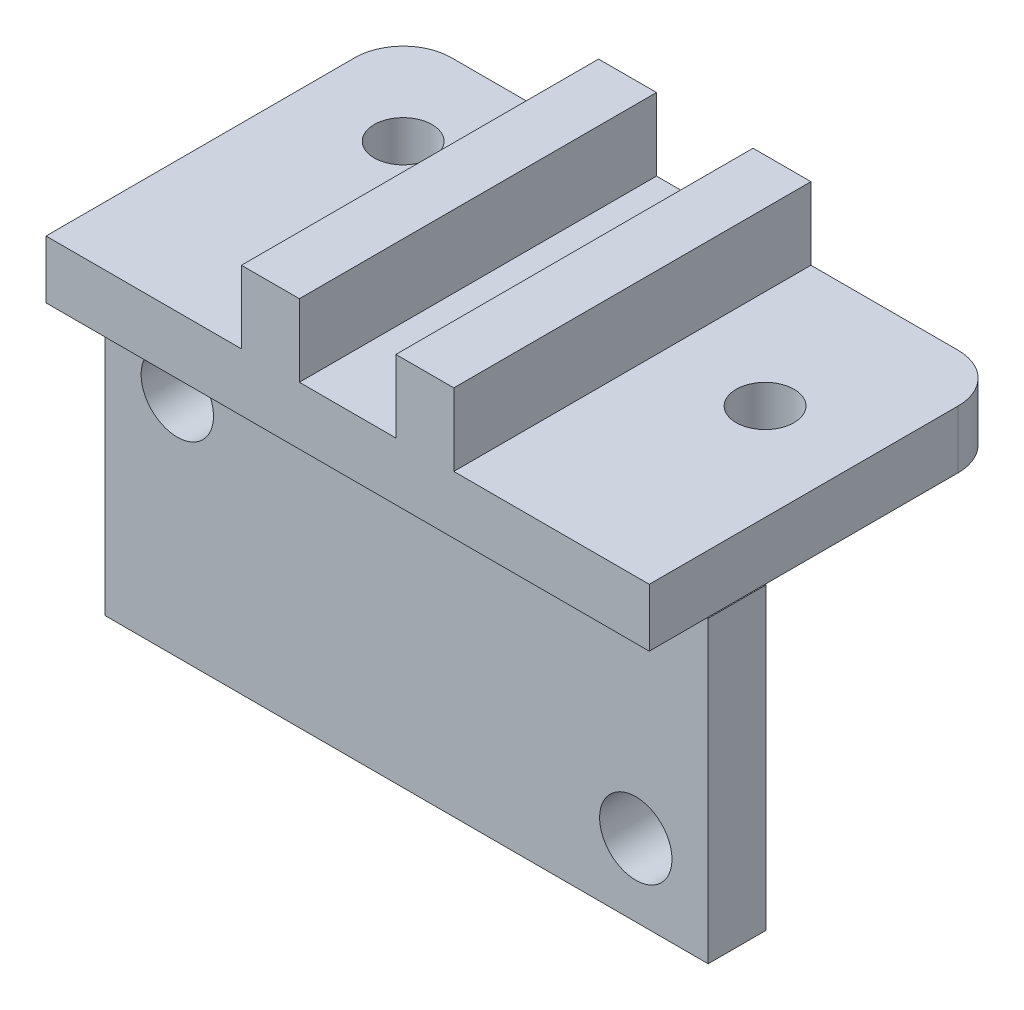
ISO-10303-21;
HEADER;
FILE_DESCRIPTION(('STEP AP214'),'2;1');
FILE_NAME('part.step','',(''),(''),'','','');
FILE_SCHEMA(('AUTOMOTIVE_DESIGN { 1 0 10303 214 1 1 1 1 }'));
ENDSEC;
DATA;
#1=APPLICATION_CONTEXT('core data for automotive mechanical design processes');
#2=APPLICATION_PROTOCOL_DEFINITION('international standard','automotive_design',2000,#1);
#3=PRODUCT_CONTEXT('',#1,'mechanical');
#4=PRODUCT('Part','Part','',(#3));
#5=PRODUCT_RELATED_PRODUCT_CATEGORY('part','',(#4));
#6=PRODUCT_DEFINITION_FORMATION('','',#4);
#7=PRODUCT_DEFINITION_CONTEXT('part definition',#1,'design');
#8=PRODUCT_DEFINITION('design','',#6,#7);
#9=PRODUCT_DEFINITION_SHAPE('','',#8);
#10=(LENGTH_UNIT() NAMED_UNIT(*) SI_UNIT(.MILLI.,.METRE.));
#11=(NAMED_UNIT(*) PLANE_ANGLE_UNIT() SI_UNIT($,.RADIAN.));
#12=(NAMED_UNIT(*) SI_UNIT($,.STERADIAN.) SOLID_ANGLE_UNIT());
#13=UNCERTAINTY_MEASURE_WITH_UNIT(LENGTH_MEASURE(1.E-05),#10,'distance_accuracy_value','');
#14=(GEOMETRIC_REPRESENTATION_CONTEXT(3) GLOBAL_UNCERTAINTY_ASSIGNED_CONTEXT((#13)) GLOBAL_UNIT_ASSIGNED_CONTEXT((#10,
#11,#12)) REPRESENTATION_CONTEXT('',''));
#15=CARTESIAN_POINT('',(0.,0.,0.));
#16=DIRECTION('',(0.,0.,1.));
#17=DIRECTION('',(1.,0.,0.));
#18=AXIS2_PLACEMENT_3D('',#15,#16,#17);
#19=CARTESIAN_POINT('',(0.,0.,0.));
#20=DIRECTION('',(0.,0.,-1.));
#21=DIRECTION('',(-1.,0.,0.));
#22=AXIS2_PLACEMENT_3D('',#19,#20,#21);
#23=PLANE('',#22);
#24=CARTESIAN_POINT('',(96.3851723763914,-47.,0.));
#25=DIRECTION('',(0.,0.,-1.));
#26=DIRECTION('',(-1.,0.,0.));
#27=AXIS2_PLACEMENT_3D('',#24,#25,#26);
#28=CIRCLE('',#27,7.5);
#29=CARTESIAN_POINT('',(88.8851723763914,-47.,0.));
#30=VERTEX_POINT('',#29);
#31=EDGE_CURVE('E272',#30,#30,#28,.T.);
#32=ORIENTED_EDGE('',*,*,#31,.F.);
#33=EDGE_LOOP('',(#32));
#34=FACE_BOUND('',#33,.T.);
#35=DIRECTION('',(1.,0.,0.));
#36=VECTOR('',#35,1.);
#37=CARTESIAN_POINT('',(-13.6148276236086,-62.,0.));
#38=LINE('',#37,#36);
#39=CARTESIAN_POINT('',(53.5465629265234,-62.,0.));
#40=VERTEX_POINT('',#39);
#41=CARTESIAN_POINT('',(111.385172376391,-62.,0.));
#42=VERTEX_POINT('',#41);
#43=EDGE_CURVE('E328',#40,#42,#38,.T.);
#44=ORIENTED_EDGE('',*,*,#43,.F.);
#45=DIRECTION('',(0.,1.,0.));
#46=VECTOR('',#45,1.);
#47=CARTESIAN_POINT('',(53.5465629265234,-62.,0.));
#48=LINE('',#47,#46);
#49=CARTESIAN_POINT('',(53.5465629265234,0.,0.));
#50=VERTEX_POINT('',#49);
#51=EDGE_CURVE('E212',#40,#50,#48,.T.);
#52=ORIENTED_EDGE('',*,*,#51,.T.);
#53=DIRECTION('',(1.,0.,0.));
#54=VECTOR('',#53,1.);
#55=CARTESIAN_POINT('',(-13.6148276236086,0.,0.));
#56=LINE('',#55,#54);
#57=CARTESIAN_POINT('',(111.180896741018,0.,0.));
#58=VERTEX_POINT('',#57);
#59=EDGE_CURVE('E351',#50,#58,#56,.T.);
#60=ORIENTED_EDGE('',*,*,#59,.T.);
#61=CARTESIAN_POINT('',(111.385172376391,0.,0.));
#62=VERTEX_POINT('',#61);
#63=EDGE_CURVE('E348',#58,#62,#56,.T.);
#64=ORIENTED_EDGE('',*,*,#63,.T.);
#65=DIRECTION('',(0.,-1.,0.));
#66=VECTOR('',#65,1.);
#67=CARTESIAN_POINT('',(111.385172376391,0.,0.));
#68=LINE('',#67,#66);
#69=EDGE_CURVE('E345',#62,#42,#68,.T.);
#70=ORIENTED_EDGE('',*,*,#69,.T.);
#71=EDGE_LOOP('',(#44,#52,#60,#64,#70));
#72=FACE_BOUND('',#71,.T.);
#73=ADVANCED_FACE('F37',(#34,#72),#23,.T.);
#74=CARTESIAN_POINT('',(1.38517237639141,-15.,0.));
#75=DIRECTION('',(0.,0.,-1.));
#76=DIRECTION('',(-1.,0.,0.));
#77=AXIS2_PLACEMENT_3D('',#74,#75,#76);
#78=CIRCLE('',#77,7.5);
#79=CARTESIAN_POINT('',(-6.11482762360859,-15.,0.));
#80=VERTEX_POINT('',#79);
#81=EDGE_CURVE('E271',#80,#80,#78,.T.);
#82=ORIENTED_EDGE('',*,*,#81,.F.);
#83=EDGE_LOOP('',(#82));
#84=FACE_BOUND('',#83,.T.);
#85=CARTESIAN_POINT('',(-13.6148276236086,0.,0.));
#86=VERTEX_POINT('',#85);
#87=CARTESIAN_POINT('',(41.5465629265235,0.,0.));
#88=VERTEX_POINT('',#87);
#89=EDGE_CURVE('E349',#86,#88,#56,.T.);
#90=ORIENTED_EDGE('',*,*,#89,.T.);
#91=DIRECTION('',(0.,1.,0.));
#92=VECTOR('',#91,1.);
#93=CARTESIAN_POINT('',(41.5465629265235,-62.,0.));
#94=LINE('',#93,#92);
#95=CARTESIAN_POINT('',(41.5465629265235,-62.,0.));
#96=VERTEX_POINT('',#95);
#97=EDGE_CURVE('E210',#96,#88,#94,.T.);
#98=ORIENTED_EDGE('',*,*,#97,.F.);
#99=CARTESIAN_POINT('',(-13.6148276236086,-62.,0.));
#100=VERTEX_POINT('',#99);
#101=EDGE_CURVE('E342',#100,#96,#38,.T.);
#102=ORIENTED_EDGE('',*,*,#101,.F.);
#103=DIRECTION('',(0.,-1.,0.));
#104=VECTOR('',#103,1.);
#105=CARTESIAN_POINT('',(-13.6148276236086,0.,0.));
#106=LINE('',#105,#104);
#107=EDGE_CURVE('E332',#86,#100,#106,.T.);
#108=ORIENTED_EDGE('',*,*,#107,.F.);
#109=EDGE_LOOP('',(#90,#98,#102,#108));
#110=FACE_BOUND('',#109,.T.);
#111=ADVANCED_FACE('F386',(#84,#110),#23,.T.);
#112=CARTESIAN_POINT('',(-3.81910325898165,0.,-40.));
#113=DIRECTION('',(0.,1.,0.));
#114=DIRECTION('',(0.,0.,1.));
#115=AXIS2_PLACEMENT_3D('',#112,#113,#114);
#116=PLANE('',#115);
#117=CARTESIAN_POINT('',(6.18089674101835,0.,-30.));
#118=DIRECTION('',(0.,-1.,0.));
#119=DIRECTION('',(0.,0.,-1.));
#120=AXIS2_PLACEMENT_3D('',#117,#118,#119);
#121=CIRCLE('',#120,6.);
#122=CARTESIAN_POINT('',(6.18089674101835,0.,-36.));
#123=VERTEX_POINT('',#122);
#124=EDGE_CURVE('E363',#123,#123,#121,.T.);
#125=ORIENTED_EDGE('',*,*,#124,.F.);
#126=EDGE_LOOP('',(#125));
#127=FACE_BOUND('',#126,.T.);
#128=CARTESIAN_POINT('',(91.1808967410184,0.,-20.));
#129=DIRECTION('',(0.,-1.,0.));
#130=DIRECTION('',(0.,0.,-1.));
#131=AXIS2_PLACEMENT_3D('',#128,#129,#130);
#132=CIRCLE('',#131,6.);
#133=CARTESIAN_POINT('',(91.1808967410184,0.,-26.));
#134=VERTEX_POINT('',#133);
#135=EDGE_CURVE('E368',#134,#134,#132,.T.);
#136=ORIENTED_EDGE('',*,*,#135,.F.);
#137=EDGE_LOOP('',(#136));
#138=FACE_BOUND('',#137,.T.);
#139=DIRECTION('',(0.,0.,-1.));
#140=VECTOR('',#139,1.);
#141=CARTESIAN_POINT('',(41.5465629265235,0.,-50.));
#142=LINE('',#141,#140);
#143=CARTESIAN_POINT('',(41.5465629265235,0.,-35.7957166897563));
#144=VERTEX_POINT('',#143);
#145=EDGE_CURVE('E193',#88,#144,#142,.T.);
#146=ORIENTED_EDGE('',*,*,#145,.F.);
#147=ORIENTED_EDGE('',*,*,#89,.F.);
#148=DIRECTION('',(0.,0.,-1.));
#149=VECTOR('',#148,1.);
#150=CARTESIAN_POINT('',(-13.6148276236086,0.,12.));
#151=LINE('',#150,#149);
#152=CARTESIAN_POINT('',(-13.6148276236086,0.,12.));
#153=VERTEX_POINT('',#152);
#154=EDGE_CURVE('E355',#153,#86,#151,.T.);
#155=ORIENTED_EDGE('',*,*,#154,.F.);
#156=DIRECTION('',(1.,0.,0.));
#157=VECTOR('',#156,1.);
#158=CARTESIAN_POINT('',(-13.6148276236086,0.,12.));
#159=LINE('',#158,#157);
#160=CARTESIAN_POINT('',(111.180896741018,0.,12.));
#161=VERTEX_POINT('',#160);
#162=EDGE_CURVE('E336',#153,#161,#159,.T.);
#163=ORIENTED_EDGE('',*,*,#162,.T.);
#164=DIRECTION('',(0.,0.,-1.));
#165=VECTOR('',#164,1.);
#166=CARTESIAN_POINT('',(111.180896741018,0.,-39.9999999999999));
#167=LINE('',#166,#165);
#168=CARTESIAN_POINT('',(111.180896741018,0.,24.));
#169=VERTEX_POINT('',#168);
#170=EDGE_CURVE('E48',#169,#161,#167,.T.);
#171=ORIENTED_EDGE('',*,*,#170,.F.);
#172=DIRECTION('',(1.,0.,0.));
#173=VECTOR('',#172,1.);
#174=CARTESIAN_POINT('',(-13.8191032589816,0.,24.));
#175=LINE('',#174,#173);
#176=CARTESIAN_POINT('',(-13.8191032589816,0.,24.));
#177=VERTEX_POINT('',#176);
#178=EDGE_CURVE('E287',#177,#169,#175,.T.);
#179=ORIENTED_EDGE('',*,*,#178,.F.);
#180=DIRECTION('',(0.,0.,1.));
#181=VECTOR('',#180,1.);
#182=CARTESIAN_POINT('',(-13.8191032589817,0.,-39.9999999999999));
#183=LINE('',#182,#181);
#184=CARTESIAN_POINT('',(-13.8191032589817,0.,-39.9999999999999));
#185=VERTEX_POINT('',#184);
#186=EDGE_CURVE('E308',#185,#177,#183,.T.);
#187=ORIENTED_EDGE('',*,*,#186,.F.);
#188=CARTESIAN_POINT('',(-3.81910325898165,0.,-40.));
#189=DIRECTION('',(0.,1.,0.));
#190=DIRECTION('',(0.,0.,1.));
#191=AXIS2_PLACEMENT_3D('',#188,#189,#190);
#192=CIRCLE('',#191,10.);
#193=CARTESIAN_POINT('',(-3.81910325898158,0.,-50.));
#194=VERTEX_POINT('',#193);
#195=EDGE_CURVE('E306',#194,#185,#192,.T.);
#196=ORIENTED_EDGE('',*,*,#195,.F.);
#197=DIRECTION('',(-1.,0.,0.));
#198=VECTOR('',#197,1.);
#199=CARTESIAN_POINT('',(-3.81910325898158,0.,-50.));
#200=LINE('',#199,#198);
#201=CARTESIAN_POINT('',(101.180896741018,0.,-50.));
#202=VERTEX_POINT('',#201);
#203=EDGE_CURVE('E304',#202,#194,#200,.T.);
#204=ORIENTED_EDGE('',*,*,#203,.F.);
#205=CARTESIAN_POINT('',(101.180896741018,0.,-40.));
#206=DIRECTION('',(0.,1.,0.));
#207=DIRECTION('',(0.,0.,-1.));
#208=AXIS2_PLACEMENT_3D('',#205,#206,#207);
#209=CIRCLE('',#208,10.);
#210=CARTESIAN_POINT('',(111.180896741018,0.,-39.9999999999999));
#211=VERTEX_POINT('',#210);
#212=EDGE_CURVE('E302',#211,#202,#209,.T.);
#213=ORIENTED_EDGE('',*,*,#212,.F.);
#214=EDGE_CURVE('E49',#58,#211,#167,.T.);
#215=ORIENTED_EDGE('',*,*,#214,.F.);
#216=ORIENTED_EDGE('',*,*,#59,.F.);
#217=DIRECTION('',(0.,0.,1.));
#218=VECTOR('',#217,1.);
#219=CARTESIAN_POINT('',(53.5465629265235,0.,-50.));
#220=LINE('',#219,#218);
#221=CARTESIAN_POINT('',(53.5465629265234,0.,-35.7957166897563));
#222=VERTEX_POINT('',#221);
#223=EDGE_CURVE('E196',#222,#50,#220,.T.);
#224=ORIENTED_EDGE('',*,*,#223,.F.);
#225=DIRECTION('',(-1.,0.,0.));
#226=VECTOR('',#225,1.);
#227=CARTESIAN_POINT('',(103.546562926523,0.,-35.7957166897563));
#228=LINE('',#227,#226);
#229=EDGE_CURVE('E188',#222,#144,#228,.T.);
#230=ORIENTED_EDGE('',*,*,#229,.T.);
#231=EDGE_LOOP('',(#146,#147,#155,#163,#171,#179,#187,#196,#204,#213,#215,#216,#224,#230));
#232=FACE_BOUND('',#231,.T.);
#233=ADVANCED_FACE('F190',(#127,#138,#232),#116,.F.);
#234=CARTESIAN_POINT('',(-3.81910325898165,12.,-40.));
#235=DIRECTION('',(0.,1.,0.));
#236=DIRECTION('',(0.,0.,1.));
#237=AXIS2_PLACEMENT_3D('',#234,#235,#236);
#238=PLANE('',#237);
#239=DIRECTION('',(1.,0.,0.));
#240=VECTOR('',#239,1.);
#241=CARTESIAN_POINT('',(-13.8191032589816,12.,24.));
#242=LINE('',#241,#240);
#243=CARTESIAN_POINT('',(38.6808967410184,12.,24.));
#244=VERTEX_POINT('',#243);
#245=CARTESIAN_POINT('',(58.6808967410184,12.,24.));
#246=VERTEX_POINT('',#245);
#247=EDGE_CURVE('E299',#244,#246,#242,.T.);
#248=ORIENTED_EDGE('',*,*,#247,.T.);
#249=DIRECTION('',(0.,0.,1.));
#250=VECTOR('',#249,1.);
#251=CARTESIAN_POINT('',(58.6808967410184,12.,-50.));
#252=LINE('',#251,#250);
#253=CARTESIAN_POINT('',(58.6808967410184,12.,-50.));
#254=VERTEX_POINT('',#253);
#255=EDGE_CURVE('E233',#254,#246,#252,.T.);
#256=ORIENTED_EDGE('',*,*,#255,.F.);
#257=DIRECTION('',(-1.,0.,0.));
#258=VECTOR('',#257,1.);
#259=CARTESIAN_POINT('',(-3.81910325898158,12.,-50.));
#260=LINE('',#259,#258);
#261=CARTESIAN_POINT('',(38.6808967410184,12.,-50.));
#262=VERTEX_POINT('',#261);
#263=EDGE_CURVE('E292',#254,#262,#260,.T.);
#264=ORIENTED_EDGE('',*,*,#263,.T.);
#265=DIRECTION('',(0.,0.,-1.));
#266=VECTOR('',#265,1.);
#267=CARTESIAN_POINT('',(38.6808967410184,12.,-50.));
#268=LINE('',#267,#266);
#269=EDGE_CURVE('E249',#244,#262,#268,.T.);
#270=ORIENTED_EDGE('',*,*,#269,.F.);
#271=EDGE_LOOP('',(#248,#256,#264,#270));
#272=FACE_BOUND('',#271,.T.);
#273=ADVANCED_FACE('F438',(#272),#238,.T.);
#274=CARTESIAN_POINT('',(91.1808967410184,12.,-20.));
#275=DIRECTION('',(0.,1.,0.));
#276=DIRECTION('',(0.,0.,1.));
#277=AXIS2_PLACEMENT_3D('',#274,#275,#276);
#278=CIRCLE('',#277,6.);
#279=CARTESIAN_POINT('',(91.1808967410184,12.,-14.));
#280=VERTEX_POINT('',#279);
#281=EDGE_CURVE('E41',#280,#280,#278,.T.);
#282=ORIENTED_EDGE('',*,*,#281,.F.);
#283=EDGE_LOOP('',(#282));
#284=FACE_BOUND('',#283,.T.);
#285=CARTESIAN_POINT('',(101.180896741018,12.,-50.));
#286=VERTEX_POINT('',#285);
#287=CARTESIAN_POINT('',(70.6808967410184,12.,-50.));
#288=VERTEX_POINT('',#287);
#289=EDGE_CURVE('E56',#286,#288,#260,.T.);
#290=ORIENTED_EDGE('',*,*,#289,.T.);
#291=DIRECTION('',(0.,0.,-1.));
#292=VECTOR('',#291,1.);
#293=CARTESIAN_POINT('',(70.6808967410184,12.,-50.));
#294=LINE('',#293,#292);
#295=CARTESIAN_POINT('',(70.6808967410184,12.,24.));
#296=VERTEX_POINT('',#295);
#297=EDGE_CURVE('E60',#296,#288,#294,.T.);
#298=ORIENTED_EDGE('',*,*,#297,.F.);
#299=CARTESIAN_POINT('',(111.180896741018,12.,24.));
#300=VERTEX_POINT('',#299);
#301=EDGE_CURVE('E296',#296,#300,#242,.T.);
#302=ORIENTED_EDGE('',*,*,#301,.T.);
#303=DIRECTION('',(0.,0.,-1.));
#304=VECTOR('',#303,1.);
#305=CARTESIAN_POINT('',(111.180896741018,12.,-39.9999999999999));
#306=LINE('',#305,#304);
#307=CARTESIAN_POINT('',(111.180896741018,12.,-39.9999999999999));
#308=VERTEX_POINT('',#307);
#309=EDGE_CURVE('E283',#300,#308,#306,.T.);
#310=ORIENTED_EDGE('',*,*,#309,.T.);
#311=CARTESIAN_POINT('',(101.180896741018,12.,-40.));
#312=DIRECTION('',(0.,1.,0.));
#313=DIRECTION('',(0.,0.,-1.));
#314=AXIS2_PLACEMENT_3D('',#311,#312,#313);
#315=CIRCLE('',#314,10.);
#316=EDGE_CURVE('E286',#308,#286,#315,.T.);
#317=ORIENTED_EDGE('',*,*,#316,.T.);
#318=EDGE_LOOP('',(#290,#298,#302,#310,#317));
#319=FACE_BOUND('',#318,.T.);
#320=ADVANCED_FACE('F433',(#284,#319),#238,.T.);
#321=CARTESIAN_POINT('',(6.18089674101835,12.,-30.));
#322=DIRECTION('',(0.,1.,0.));
#323=DIRECTION('',(0.,0.,1.));
#324=AXIS2_PLACEMENT_3D('',#321,#322,#323);
#325=CIRCLE('',#324,6.);
#326=CARTESIAN_POINT('',(6.18089674101835,12.,-24.));
#327=VERTEX_POINT('',#326);
#328=EDGE_CURVE('E361',#327,#327,#325,.T.);
#329=ORIENTED_EDGE('',*,*,#328,.F.);
#330=EDGE_LOOP('',(#329));
#331=FACE_BOUND('',#330,.T.);
#332=DIRECTION('',(0.,0.,1.));
#333=VECTOR('',#332,1.);
#334=CARTESIAN_POINT('',(26.6808967410184,12.,-50.));
#335=LINE('',#334,#333);
#336=CARTESIAN_POINT('',(26.6808967410184,12.,-50.));
#337=VERTEX_POINT('',#336);
#338=CARTESIAN_POINT('',(26.6808967410184,12.,24.));
#339=VERTEX_POINT('',#338);
#340=EDGE_CURVE('E237',#337,#339,#335,.T.);
#341=ORIENTED_EDGE('',*,*,#340,.F.);
#342=CARTESIAN_POINT('',(-3.81910325898158,12.,-50.));
#343=VERTEX_POINT('',#342);
#344=EDGE_CURVE('E289',#337,#343,#260,.T.);
#345=ORIENTED_EDGE('',*,*,#344,.T.);
#346=CARTESIAN_POINT('',(-3.81910325898165,12.,-40.));
#347=DIRECTION('',(0.,1.,0.));
#348=DIRECTION('',(0.,0.,1.));
#349=AXIS2_PLACEMENT_3D('',#346,#347,#348);
#350=CIRCLE('',#349,10.);
#351=CARTESIAN_POINT('',(-13.8191032589817,12.,-39.9999999999999));
#352=VERTEX_POINT('',#351);
#353=EDGE_CURVE('E291',#343,#352,#350,.T.);
#354=ORIENTED_EDGE('',*,*,#353,.T.);
#355=DIRECTION('',(0.,0.,1.));
#356=VECTOR('',#355,1.);
#357=CARTESIAN_POINT('',(-13.8191032589817,12.,-39.9999999999999));
#358=LINE('',#357,#356);
#359=CARTESIAN_POINT('',(-13.8191032589816,12.,24.));
#360=VERTEX_POINT('',#359);
#361=EDGE_CURVE('E294',#352,#360,#358,.T.);
#362=ORIENTED_EDGE('',*,*,#361,.T.);
#363=EDGE_CURVE('E297',#360,#339,#242,.T.);
#364=ORIENTED_EDGE('',*,*,#363,.T.);
#365=EDGE_LOOP('',(#341,#345,#354,#362,#364));
#366=FACE_BOUND('',#365,.T.);
#367=ADVANCED_FACE('F449',(#331,#366),#238,.T.);
#368=CARTESIAN_POINT('',(-13.6148276236086,-62.,12.));
#369=DIRECTION('',(0.,1.,0.));
#370=DIRECTION('',(0.,0.,1.));
#371=AXIS2_PLACEMENT_3D('',#368,#369,#370);
#372=PLANE('',#371);
#373=ORIENTED_EDGE('',*,*,#101,.T.);
#374=DIRECTION('',(-1.,0.,0.));
#375=VECTOR('',#374,1.);
#376=CARTESIAN_POINT('',(103.546562926523,-62.,0.));
#377=LINE('',#376,#375);
#378=EDGE_CURVE('E200',#40,#96,#377,.T.);
#379=ORIENTED_EDGE('',*,*,#378,.F.);
#380=ORIENTED_EDGE('',*,*,#43,.T.);
#381=DIRECTION('',(0.,0.,-1.));
#382=VECTOR('',#381,1.);
#383=CARTESIAN_POINT('',(111.385172376391,-62.,12.));
#384=LINE('',#383,#382);
#385=CARTESIAN_POINT('',(111.385172376391,-62.,12.));
#386=VERTEX_POINT('',#385);
#387=EDGE_CURVE('E46',#386,#42,#384,.T.);
#388=ORIENTED_EDGE('',*,*,#387,.F.);
#389=DIRECTION('',(1.,0.,0.));
#390=VECTOR('',#389,1.);
#391=CARTESIAN_POINT('',(-13.6148276236086,-62.,12.));
#392=LINE('',#391,#390);
#393=CARTESIAN_POINT('',(-13.6148276236086,-62.,12.));
#394=VERTEX_POINT('',#393);
#395=EDGE_CURVE('E329',#394,#386,#392,.T.);
#396=ORIENTED_EDGE('',*,*,#395,.F.);
#397=DIRECTION('',(0.,0.,-1.));
#398=VECTOR('',#397,1.);
#399=CARTESIAN_POINT('',(-13.6148276236086,-62.,12.));
#400=LINE('',#399,#398);
#401=EDGE_CURVE('E341',#394,#100,#400,.T.);
#402=ORIENTED_EDGE('',*,*,#401,.T.);
#403=EDGE_LOOP('',(#373,#379,#380,#388,#396,#402));
#404=FACE_BOUND('',#403,.T.);
#405=ADVANCED_FACE('F39',(#404),#372,.F.);
#406=CARTESIAN_POINT('',(111.385172376391,0.,12.));
#407=DIRECTION('',(1.,0.,0.));
#408=DIRECTION('',(0.,1.,0.));
#409=AXIS2_PLACEMENT_3D('',#406,#407,#408);
#410=PLANE('',#409);
#411=ORIENTED_EDGE('',*,*,#69,.F.);
#412=DIRECTION('',(0.,0.,-1.));
#413=VECTOR('',#412,1.);
#414=CARTESIAN_POINT('',(111.385172376391,0.,12.));
#415=LINE('',#414,#413);
#416=CARTESIAN_POINT('',(111.385172376391,0.,12.));
#417=VERTEX_POINT('',#416);
#418=EDGE_CURVE('E357',#417,#62,#415,.T.);
#419=ORIENTED_EDGE('',*,*,#418,.F.);
#420=DIRECTION('',(0.,-1.,0.));
#421=VECTOR('',#420,1.);
#422=CARTESIAN_POINT('',(111.385172376391,0.,12.));
#423=LINE('',#422,#421);
#424=EDGE_CURVE('E331',#417,#386,#423,.T.);
#425=ORIENTED_EDGE('',*,*,#424,.T.);
#426=ORIENTED_EDGE('',*,*,#387,.T.);
#427=EDGE_LOOP('',(#411,#419,#425,#426));
#428=FACE_BOUND('',#427,.T.);
#429=ADVANCED_FACE('F402',(#428),#410,.T.);
#430=CARTESIAN_POINT('',(-13.6148276236086,0.,12.));
#431=DIRECTION('',(0.,1.,0.));
#432=DIRECTION('',(0.,0.,1.));
#433=AXIS2_PLACEMENT_3D('',#430,#431,#432);
#434=PLANE('',#433);
#435=EDGE_CURVE('E11',#161,#58,#167,.T.);
#436=ORIENTED_EDGE('',*,*,#435,.F.);
#437=EDGE_CURVE('E335',#161,#417,#159,.T.);
#438=ORIENTED_EDGE('',*,*,#437,.T.);
#439=ORIENTED_EDGE('',*,*,#418,.T.);
#440=ORIENTED_EDGE('',*,*,#63,.F.);
#441=EDGE_LOOP('',(#436,#438,#439,#440));
#442=FACE_BOUND('',#441,.T.);
#443=ADVANCED_FACE('F398',(#442),#434,.T.);
#444=CARTESIAN_POINT('',(-13.6148276236086,0.,12.));
#445=DIRECTION('',(1.,0.,0.));
#446=DIRECTION('',(0.,1.,0.));
#447=AXIS2_PLACEMENT_3D('',#444,#445,#446);
#448=PLANE('',#447);
#449=ORIENTED_EDGE('',*,*,#107,.T.);
#450=ORIENTED_EDGE('',*,*,#401,.F.);
#451=DIRECTION('',(0.,-1.,0.));
#452=VECTOR('',#451,1.);
#453=CARTESIAN_POINT('',(-13.6148276236086,0.,12.));
#454=LINE('',#453,#452);
#455=EDGE_CURVE('E339',#153,#394,#454,.T.);
#456=ORIENTED_EDGE('',*,*,#455,.F.);
#457=ORIENTED_EDGE('',*,*,#154,.T.);
#458=EDGE_LOOP('',(#449,#450,#456,#457));
#459=FACE_BOUND('',#458,.T.);
#460=ADVANCED_FACE('F391',(#459),#448,.F.);
#461=CARTESIAN_POINT('',(0.,0.,12.));
#462=DIRECTION('',(0.,0.,-1.));
#463=DIRECTION('',(-1.,0.,0.));
#464=AXIS2_PLACEMENT_3D('',#461,#462,#463);
#465=PLANE('',#464);
#466=CARTESIAN_POINT('',(96.3851723763914,-47.,12.));
#467=DIRECTION('',(0.,0.,-1.));
#468=DIRECTION('',(-1.,0.,0.));
#469=AXIS2_PLACEMENT_3D('',#466,#467,#468);
#470=CIRCLE('',#469,7.5);
#471=CARTESIAN_POINT('',(88.8851723763914,-47.,12.));
#472=VERTEX_POINT('',#471);
#473=EDGE_CURVE('E280',#472,#472,#470,.T.);
#474=ORIENTED_EDGE('',*,*,#473,.T.);
#475=EDGE_LOOP('',(#474));
#476=FACE_BOUND('',#475,.T.);
#477=CARTESIAN_POINT('',(1.38517237639141,-15.,12.));
#478=DIRECTION('',(0.,0.,-1.));
#479=DIRECTION('',(-1.,0.,0.));
#480=AXIS2_PLACEMENT_3D('',#477,#478,#479);
#481=CIRCLE('',#480,7.5);
#482=CARTESIAN_POINT('',(-6.11482762360859,-15.,12.));
#483=VERTEX_POINT('',#482);
#484=EDGE_CURVE('E275',#483,#483,#481,.T.);
#485=ORIENTED_EDGE('',*,*,#484,.T.);
#486=EDGE_LOOP('',(#485));
#487=FACE_BOUND('',#486,.T.);
#488=ORIENTED_EDGE('',*,*,#395,.T.);
#489=ORIENTED_EDGE('',*,*,#424,.F.);
#490=ORIENTED_EDGE('',*,*,#437,.F.);
#491=ORIENTED_EDGE('',*,*,#162,.F.);
#492=ORIENTED_EDGE('',*,*,#455,.T.);
#493=EDGE_LOOP('',(#488,#489,#490,#491,#492));
#494=FACE_BOUND('',#493,.T.);
#495=ADVANCED_FACE('F394',(#476,#487,#494),#465,.F.);
#496=CARTESIAN_POINT('',(111.180896741018,12.,-39.9999999999999));
#497=DIRECTION('',(-1.,0.,0.));
#498=DIRECTION('',(0.,0.,1.));
#499=AXIS2_PLACEMENT_3D('',#496,#497,#498);
#500=PLANE('',#499);
#501=ORIENTED_EDGE('',*,*,#170,.T.);
#502=ORIENTED_EDGE('',*,*,#435,.T.);
#503=ORIENTED_EDGE('',*,*,#214,.T.);
#504=DIRECTION('',(0.,-1.,0.));
#505=VECTOR('',#504,1.);
#506=CARTESIAN_POINT('',(111.180896741018,12.,-39.9999999999999));
#507=LINE('',#506,#505);
#508=EDGE_CURVE('E325',#308,#211,#507,.T.);
#509=ORIENTED_EDGE('',*,*,#508,.F.);
#510=ORIENTED_EDGE('',*,*,#309,.F.);
#511=DIRECTION('',(0.,-1.,0.));
#512=VECTOR('',#511,1.);
#513=CARTESIAN_POINT('',(111.180896741018,12.,24.));
#514=LINE('',#513,#512);
#515=EDGE_CURVE('E298',#300,#169,#514,.T.);
#516=ORIENTED_EDGE('',*,*,#515,.T.);
#517=EDGE_LOOP('',(#501,#502,#503,#509,#510,#516));
#518=FACE_BOUND('',#517,.T.);
#519=ADVANCED_FACE('F409',(#518),#500,.F.);
#520=CARTESIAN_POINT('',(101.180896741018,12.,-40.));
#521=DIRECTION('',(0.,-1.,0.));
#522=DIRECTION('',(0.,0.,-1.));
#523=AXIS2_PLACEMENT_3D('',#520,#521,#522);
#524=CYLINDRICAL_SURFACE('',#523,10.);
#525=ORIENTED_EDGE('',*,*,#212,.T.);
#526=DIRECTION('',(0.,-1.,0.));
#527=VECTOR('',#526,1.);
#528=CARTESIAN_POINT('',(101.180896741018,12.,-50.));
#529=LINE('',#528,#527);
#530=EDGE_CURVE('E322',#286,#202,#529,.T.);
#531=ORIENTED_EDGE('',*,*,#530,.F.);
#532=ORIENTED_EDGE('',*,*,#316,.F.);
#533=ORIENTED_EDGE('',*,*,#508,.T.);
#534=EDGE_LOOP('',(#525,#531,#532,#533));
#535=FACE_BOUND('',#534,.T.);
#536=ADVANCED_FACE('F432',(#535),#524,.T.);
#537=CARTESIAN_POINT('',(-3.81910325898158,12.,-50.));
#538=DIRECTION('',(0.,0.,1.));
#539=DIRECTION('',(1.,0.,0.));
#540=AXIS2_PLACEMENT_3D('',#537,#538,#539);
#541=PLANE('',#540);
#542=ORIENTED_EDGE('',*,*,#203,.T.);
#543=DIRECTION('',(0.,-1.,0.));
#544=VECTOR('',#543,1.);
#545=CARTESIAN_POINT('',(-3.81910325898158,12.,-50.));
#546=LINE('',#545,#544);
#547=EDGE_CURVE('E319',#343,#194,#546,.T.);
#548=ORIENTED_EDGE('',*,*,#547,.F.);
#549=ORIENTED_EDGE('',*,*,#344,.F.);
#550=DIRECTION('',(0.,-1.,0.));
#551=VECTOR('',#550,1.);
#552=CARTESIAN_POINT('',(26.6808967410184,27.,-50.));
#553=LINE('',#552,#551);
#554=CARTESIAN_POINT('',(26.6808967410184,27.,-50.));
#555=VERTEX_POINT('',#554);
#556=EDGE_CURVE('E255',#555,#337,#553,.T.);
#557=ORIENTED_EDGE('',*,*,#556,.F.);
#558=DIRECTION('',(-1.,0.,0.));
#559=VECTOR('',#558,1.);
#560=CARTESIAN_POINT('',(26.6808967410184,27.,-50.));
#561=LINE('',#560,#559);
#562=CARTESIAN_POINT('',(38.6808967410184,27.,-50.));
#563=VERTEX_POINT('',#562);
#564=EDGE_CURVE('E253',#563,#555,#561,.T.);
#565=ORIENTED_EDGE('',*,*,#564,.F.);
#566=DIRECTION('',(0.,-1.,0.));
#567=VECTOR('',#566,1.);
#568=CARTESIAN_POINT('',(38.6808967410184,27.,-50.));
#569=LINE('',#568,#567);
#570=EDGE_CURVE('E262',#563,#262,#569,.T.);
#571=ORIENTED_EDGE('',*,*,#570,.T.);
#572=ORIENTED_EDGE('',*,*,#263,.F.);
#573=DIRECTION('',(0.,-1.,0.));
#574=VECTOR('',#573,1.);
#575=CARTESIAN_POINT('',(58.6808967410184,27.,-50.));
#576=LINE('',#575,#574);
#577=CARTESIAN_POINT('',(58.6808967410184,27.,-50.));
#578=VERTEX_POINT('',#577);
#579=EDGE_CURVE('E228',#578,#254,#576,.T.);
#580=ORIENTED_EDGE('',*,*,#579,.F.);
#581=DIRECTION('',(-1.,0.,0.));
#582=VECTOR('',#581,1.);
#583=CARTESIAN_POINT('',(58.6808967410184,27.,-50.));
#584=LINE('',#583,#582);
#585=CARTESIAN_POINT('',(70.6808967410184,27.,-50.));
#586=VERTEX_POINT('',#585);
#587=EDGE_CURVE('E231',#586,#578,#584,.T.);
#588=ORIENTED_EDGE('',*,*,#587,.F.);
#589=DIRECTION('',(0.,-1.,0.));
#590=VECTOR('',#589,1.);
#591=CARTESIAN_POINT('',(70.6808967410184,27.,-50.));
#592=LINE('',#591,#590);
#593=EDGE_CURVE('E225',#586,#288,#592,.T.);
#594=ORIENTED_EDGE('',*,*,#593,.T.);
#595=ORIENTED_EDGE('',*,*,#289,.F.);
#596=ORIENTED_EDGE('',*,*,#530,.T.);
#597=EDGE_LOOP('',(#542,#548,#549,#557,#565,#571,#572,#580,#588,#594,#595,#596));
#598=FACE_BOUND('',#597,.T.);
#599=ADVANCED_FACE('F428',(#598),#541,.F.);
#600=CARTESIAN_POINT('',(-3.81910325898165,12.,-40.));
#601=DIRECTION('',(0.,-1.,0.));
#602=DIRECTION('',(0.,0.,-1.));
#603=AXIS2_PLACEMENT_3D('',#600,#601,#602);
#604=CYLINDRICAL_SURFACE('',#603,10.);
#605=ORIENTED_EDGE('',*,*,#195,.T.);
#606=DIRECTION('',(0.,-1.,0.));
#607=VECTOR('',#606,1.);
#608=CARTESIAN_POINT('',(-13.8191032589817,12.,-39.9999999999999));
#609=LINE('',#608,#607);
#610=EDGE_CURVE('E316',#352,#185,#609,.T.);
#611=ORIENTED_EDGE('',*,*,#610,.F.);
#612=ORIENTED_EDGE('',*,*,#353,.F.);
#613=ORIENTED_EDGE('',*,*,#547,.T.);
#614=EDGE_LOOP('',(#605,#611,#612,#613));
#615=FACE_BOUND('',#614,.T.);
#616=ADVANCED_FACE('F425',(#615),#604,.T.);
#617=CARTESIAN_POINT('',(-13.8191032589817,12.,-39.9999999999999));
#618=DIRECTION('',(1.,0.,0.));
#619=DIRECTION('',(0.,0.,-1.));
#620=AXIS2_PLACEMENT_3D('',#617,#618,#619);
#621=PLANE('',#620);
#622=ORIENTED_EDGE('',*,*,#186,.T.);
#623=DIRECTION('',(0.,-1.,0.));
#624=VECTOR('',#623,1.);
#625=CARTESIAN_POINT('',(-13.8191032589816,12.,24.));
#626=LINE('',#625,#624);
#627=EDGE_CURVE('E313',#360,#177,#626,.T.);
#628=ORIENTED_EDGE('',*,*,#627,.F.);
#629=ORIENTED_EDGE('',*,*,#361,.F.);
#630=ORIENTED_EDGE('',*,*,#610,.T.);
#631=EDGE_LOOP('',(#622,#628,#629,#630));
#632=FACE_BOUND('',#631,.T.);
#633=ADVANCED_FACE('F421',(#632),#621,.F.);
#634=CARTESIAN_POINT('',(-13.8191032589816,12.,24.));
#635=DIRECTION('',(0.,0.,-1.));
#636=DIRECTION('',(-1.,0.,0.));
#637=AXIS2_PLACEMENT_3D('',#634,#635,#636);
#638=PLANE('',#637);
#639=ORIENTED_EDGE('',*,*,#178,.T.);
#640=ORIENTED_EDGE('',*,*,#515,.F.);
#641=ORIENTED_EDGE('',*,*,#301,.F.);
#642=DIRECTION('',(0.,-1.,0.));
#643=VECTOR('',#642,1.);
#644=CARTESIAN_POINT('',(70.6808967410184,27.,24.));
#645=LINE('',#644,#643);
#646=CARTESIAN_POINT('',(70.6808967410184,27.,24.));
#647=VERTEX_POINT('',#646);
#648=EDGE_CURVE('E222',#647,#296,#645,.T.);
#649=ORIENTED_EDGE('',*,*,#648,.F.);
#650=DIRECTION('',(1.,0.,0.));
#651=VECTOR('',#650,1.);
#652=CARTESIAN_POINT('',(58.6808967410184,27.,24.));
#653=LINE('',#652,#651);
#654=CARTESIAN_POINT('',(58.6808967410184,27.,24.));
#655=VERTEX_POINT('',#654);
#656=EDGE_CURVE('E241',#655,#647,#653,.T.);
#657=ORIENTED_EDGE('',*,*,#656,.F.);
#658=DIRECTION('',(0.,-1.,0.));
#659=VECTOR('',#658,1.);
#660=CARTESIAN_POINT('',(58.6808967410184,27.,24.));
#661=LINE('',#660,#659);
#662=EDGE_CURVE('E219',#655,#246,#661,.T.);
#663=ORIENTED_EDGE('',*,*,#662,.T.);
#664=ORIENTED_EDGE('',*,*,#247,.F.);
#665=DIRECTION('',(0.,-1.,0.));
#666=VECTOR('',#665,1.);
#667=CARTESIAN_POINT('',(38.6808967410184,27.,24.));
#668=LINE('',#667,#666);
#669=CARTESIAN_POINT('',(38.6808967410184,27.,24.));
#670=VERTEX_POINT('',#669);
#671=EDGE_CURVE('E265',#670,#244,#668,.T.);
#672=ORIENTED_EDGE('',*,*,#671,.F.);
#673=DIRECTION('',(1.,0.,0.));
#674=VECTOR('',#673,1.);
#675=CARTESIAN_POINT('',(26.6808967410184,27.,24.));
#676=LINE('',#675,#674);
#677=CARTESIAN_POINT('',(26.6808967410184,27.,24.));
#678=VERTEX_POINT('',#677);
#679=EDGE_CURVE('E248',#678,#670,#676,.T.);
#680=ORIENTED_EDGE('',*,*,#679,.F.);
#681=DIRECTION('',(0.,-1.,0.));
#682=VECTOR('',#681,1.);
#683=CARTESIAN_POINT('',(26.6808967410184,27.,24.));
#684=LINE('',#683,#682);
#685=EDGE_CURVE('E268',#678,#339,#684,.T.);
#686=ORIENTED_EDGE('',*,*,#685,.T.);
#687=ORIENTED_EDGE('',*,*,#363,.F.);
#688=ORIENTED_EDGE('',*,*,#627,.T.);
#689=EDGE_LOOP('',(#639,#640,#641,#649,#657,#663,#664,#672,#680,#686,#687,#688));
#690=FACE_BOUND('',#689,.T.);
#691=ADVANCED_FACE('F416',(#690),#638,.F.);
#692=CARTESIAN_POINT('',(1.38517237639141,-15.,68.));
#693=DIRECTION('',(0.,0.,-1.));
#694=DIRECTION('',(-1.,0.,0.));
#695=AXIS2_PLACEMENT_3D('',#692,#693,#694);
#696=CYLINDRICAL_SURFACE('',#695,7.5);
#697=ORIENTED_EDGE('',*,*,#81,.T.);
#698=EDGE_LOOP('',(#697));
#699=FACE_BOUND('',#698,.T.);
#700=ORIENTED_EDGE('',*,*,#484,.F.);
#701=EDGE_LOOP('',(#700));
#702=FACE_BOUND('',#701,.T.);
#703=ADVANCED_FACE('F509',(#699,#702),#696,.F.);
#704=CARTESIAN_POINT('',(96.3851723763914,-47.,68.));
#705=DIRECTION('',(0.,0.,-1.));
#706=DIRECTION('',(-1.,0.,0.));
#707=AXIS2_PLACEMENT_3D('',#704,#705,#706);
#708=CYLINDRICAL_SURFACE('',#707,7.5);
#709=ORIENTED_EDGE('',*,*,#31,.T.);
#710=EDGE_LOOP('',(#709));
#711=FACE_BOUND('',#710,.T.);
#712=ORIENTED_EDGE('',*,*,#473,.F.);
#713=EDGE_LOOP('',(#712));
#714=FACE_BOUND('',#713,.T.);
#715=ADVANCED_FACE('F467',(#711,#714),#708,.F.);
#716=CARTESIAN_POINT('',(26.6808967410184,27.,-50.));
#717=DIRECTION('',(1.,0.,0.));
#718=DIRECTION('',(0.,0.,-1.));
#719=AXIS2_PLACEMENT_3D('',#716,#717,#718);
#720=PLANE('',#719);
#721=ORIENTED_EDGE('',*,*,#340,.T.);
#722=ORIENTED_EDGE('',*,*,#685,.F.);
#723=DIRECTION('',(0.,0.,1.));
#724=VECTOR('',#723,1.);
#725=CARTESIAN_POINT('',(26.6808967410184,27.,-50.));
#726=LINE('',#725,#724);
#727=EDGE_CURVE('E245',#555,#678,#726,.T.);
#728=ORIENTED_EDGE('',*,*,#727,.F.);
#729=ORIENTED_EDGE('',*,*,#556,.T.);
#730=EDGE_LOOP('',(#721,#722,#728,#729));
#731=FACE_BOUND('',#730,.T.);
#732=ADVANCED_FACE('F453',(#731),#720,.F.);
#733=CARTESIAN_POINT('',(38.6808967410184,27.,-50.));
#734=DIRECTION('',(-1.,0.,0.));
#735=DIRECTION('',(0.,0.,1.));
#736=AXIS2_PLACEMENT_3D('',#733,#734,#735);
#737=PLANE('',#736);
#738=ORIENTED_EDGE('',*,*,#269,.T.);
#739=ORIENTED_EDGE('',*,*,#570,.F.);
#740=DIRECTION('',(0.,0.,-1.));
#741=VECTOR('',#740,1.);
#742=CARTESIAN_POINT('',(38.6808967410184,27.,-50.));
#743=LINE('',#742,#741);
#744=EDGE_CURVE('E251',#670,#563,#743,.T.);
#745=ORIENTED_EDGE('',*,*,#744,.F.);
#746=ORIENTED_EDGE('',*,*,#671,.T.);
#747=EDGE_LOOP('',(#738,#739,#745,#746));
#748=FACE_BOUND('',#747,.T.);
#749=ADVANCED_FACE('F459',(#748),#737,.F.);
#750=CARTESIAN_POINT('',(0.,27.,0.));
#751=DIRECTION('',(0.,1.,0.));
#752=DIRECTION('',(0.,0.,1.));
#753=AXIS2_PLACEMENT_3D('',#750,#751,#752);
#754=PLANE('',#753);
#755=ORIENTED_EDGE('',*,*,#727,.T.);
#756=ORIENTED_EDGE('',*,*,#679,.T.);
#757=ORIENTED_EDGE('',*,*,#744,.T.);
#758=ORIENTED_EDGE('',*,*,#564,.T.);
#759=EDGE_LOOP('',(#755,#756,#757,#758));
#760=FACE_BOUND('',#759,.T.);
#761=ADVANCED_FACE('F456',(#760),#754,.T.);
#762=CARTESIAN_POINT('',(58.6808967410184,27.,-50.));
#763=DIRECTION('',(1.,0.,0.));
#764=DIRECTION('',(0.,0.,-1.));
#765=AXIS2_PLACEMENT_3D('',#762,#763,#764);
#766=PLANE('',#765);
#767=ORIENTED_EDGE('',*,*,#255,.T.);
#768=ORIENTED_EDGE('',*,*,#662,.F.);
#769=DIRECTION('',(0.,0.,1.));
#770=VECTOR('',#769,1.);
#771=CARTESIAN_POINT('',(58.6808967410184,27.,-50.));
#772=LINE('',#771,#770);
#773=EDGE_CURVE('E234',#578,#655,#772,.T.);
#774=ORIENTED_EDGE('',*,*,#773,.F.);
#775=ORIENTED_EDGE('',*,*,#579,.T.);
#776=EDGE_LOOP('',(#767,#768,#774,#775));
#777=FACE_BOUND('',#776,.T.);
#778=ADVANCED_FACE('F443',(#777),#766,.F.);
#779=CARTESIAN_POINT('',(70.6808967410184,27.,-50.));
#780=DIRECTION('',(-1.,0.,0.));
#781=DIRECTION('',(0.,0.,1.));
#782=AXIS2_PLACEMENT_3D('',#779,#780,#781);
#783=PLANE('',#782);
#784=ORIENTED_EDGE('',*,*,#297,.T.);
#785=ORIENTED_EDGE('',*,*,#593,.F.);
#786=DIRECTION('',(0.,0.,-1.));
#787=VECTOR('',#786,1.);
#788=CARTESIAN_POINT('',(70.6808967410184,27.,-50.));
#789=LINE('',#788,#787);
#790=EDGE_CURVE('E239',#647,#586,#789,.T.);
#791=ORIENTED_EDGE('',*,*,#790,.F.);
#792=ORIENTED_EDGE('',*,*,#648,.T.);
#793=EDGE_LOOP('',(#784,#785,#791,#792));
#794=FACE_BOUND('',#793,.T.);
#795=ADVANCED_FACE('F568',(#794),#783,.F.);
#796=CARTESIAN_POINT('',(0.,27.,0.));
#797=DIRECTION('',(0.,1.,0.));
#798=DIRECTION('',(0.,0.,1.));
#799=AXIS2_PLACEMENT_3D('',#796,#797,#798);
#800=PLANE('',#799);
#801=ORIENTED_EDGE('',*,*,#773,.T.);
#802=ORIENTED_EDGE('',*,*,#656,.T.);
#803=ORIENTED_EDGE('',*,*,#790,.T.);
#804=ORIENTED_EDGE('',*,*,#587,.T.);
#805=EDGE_LOOP('',(#801,#802,#803,#804));
#806=FACE_BOUND('',#805,.T.);
#807=ADVANCED_FACE('F578',(#806),#800,.T.);
#808=CARTESIAN_POINT('',(53.5465629265235,-62.,-50.));
#809=DIRECTION('',(-1.,0.,0.));
#810=DIRECTION('',(0.,0.,1.));
#811=AXIS2_PLACEMENT_3D('',#808,#809,#810);
#812=PLANE('',#811);
#813=ORIENTED_EDGE('',*,*,#51,.F.);
#814=DIRECTION('',(0.,0.866025403784442,-0.499999999999995));
#815=VECTOR('',#814,1.);
#816=CARTESIAN_POINT('',(53.5465629265234,-40.3493649053892,-12.4999999999997));
#817=LINE('',#816,#815);
#818=EDGE_CURVE('E199',#40,#222,#817,.T.);
#819=ORIENTED_EDGE('',*,*,#818,.T.);
#820=ORIENTED_EDGE('',*,*,#223,.T.);
#821=EDGE_LOOP('',(#813,#819,#820));
#822=FACE_BOUND('',#821,.T.);
#823=ADVANCED_FACE('F377',(#822),#812,.F.);
#824=CARTESIAN_POINT('',(41.5465629265235,-62.,-50.));
#825=DIRECTION('',(1.,0.,0.));
#826=DIRECTION('',(0.,0.,-1.));
#827=AXIS2_PLACEMENT_3D('',#824,#825,#826);
#828=PLANE('',#827);
#829=ORIENTED_EDGE('',*,*,#145,.T.);
#830=DIRECTION('',(0.,0.866025403784442,-0.499999999999995));
#831=VECTOR('',#830,1.);
#832=CARTESIAN_POINT('',(41.5465629265235,0.,-35.7957166897563));
#833=LINE('',#832,#831);
#834=EDGE_CURVE('E203',#96,#144,#833,.T.);
#835=ORIENTED_EDGE('',*,*,#834,.F.);
#836=ORIENTED_EDGE('',*,*,#97,.T.);
#837=EDGE_LOOP('',(#829,#835,#836));
#838=FACE_BOUND('',#837,.T.);
#839=ADVANCED_FACE('F209',(#838),#828,.F.);
#840=CARTESIAN_POINT('',(103.546562926523,0.,-35.7957166897563));
#841=DIRECTION('',(0.,0.499999999999995,0.866025403784442));
#842=DIRECTION('',(0.,-0.866025403784442,0.499999999999995));
#843=AXIS2_PLACEMENT_3D('',#840,#841,#842);
#844=PLANE('',#843);
#845=ORIENTED_EDGE('',*,*,#378,.T.);
#846=ORIENTED_EDGE('',*,*,#834,.T.);
#847=ORIENTED_EDGE('',*,*,#229,.F.);
#848=ORIENTED_EDGE('',*,*,#818,.F.);
#849=EDGE_LOOP('',(#845,#846,#847,#848));
#850=FACE_BOUND('',#849,.T.);
#851=ADVANCED_FACE('F204',(#850),#844,.F.);
#852=CARTESIAN_POINT('',(6.18089674101835,62.,-30.));
#853=DIRECTION('',(0.,-1.,0.));
#854=DIRECTION('',(0.,0.,-1.));
#855=AXIS2_PLACEMENT_3D('',#852,#853,#854);
#856=CYLINDRICAL_SURFACE('',#855,6.);
#857=ORIENTED_EDGE('',*,*,#328,.T.);
#858=EDGE_LOOP('',(#857));
#859=FACE_BOUND('',#858,.T.);
#860=ORIENTED_EDGE('',*,*,#124,.T.);
#861=EDGE_LOOP('',(#860));
#862=FACE_BOUND('',#861,.T.);
#863=ADVANCED_FACE('F650',(#859,#862),#856,.F.);
#864=CARTESIAN_POINT('',(91.1808967410184,62.,-20.));
#865=DIRECTION('',(0.,-1.,0.));
#866=DIRECTION('',(0.,0.,-1.));
#867=AXIS2_PLACEMENT_3D('',#864,#865,#866);
#868=CYLINDRICAL_SURFACE('',#867,6.);
#869=ORIENTED_EDGE('',*,*,#281,.T.);
#870=EDGE_LOOP('',(#869));
#871=FACE_BOUND('',#870,.T.);
#872=ORIENTED_EDGE('',*,*,#135,.T.);
#873=EDGE_LOOP('',(#872));
#874=FACE_BOUND('',#873,.T.);
#875=ADVANCED_FACE('F676',(#871,#874),#868,.F.);
#876=CLOSED_SHELL('',(#73,#111,#233,#273,#320,#367,#405,#429,#443,#460,#495,#519,#536,#599,#616,
#633,#691,#703,#715,#732,#749,#761,#778,#795,#807,#823,#839,#851,#863,#875));
#877=MANIFOLD_SOLID_BREP('B2',#876);
#878=ADVANCED_BREP_SHAPE_REPRESENTATION('',(#18,#877),#14);
#879=SHAPE_DEFINITION_REPRESENTATION(#9,#878);
ENDSEC;
END-ISO-10303-21;
